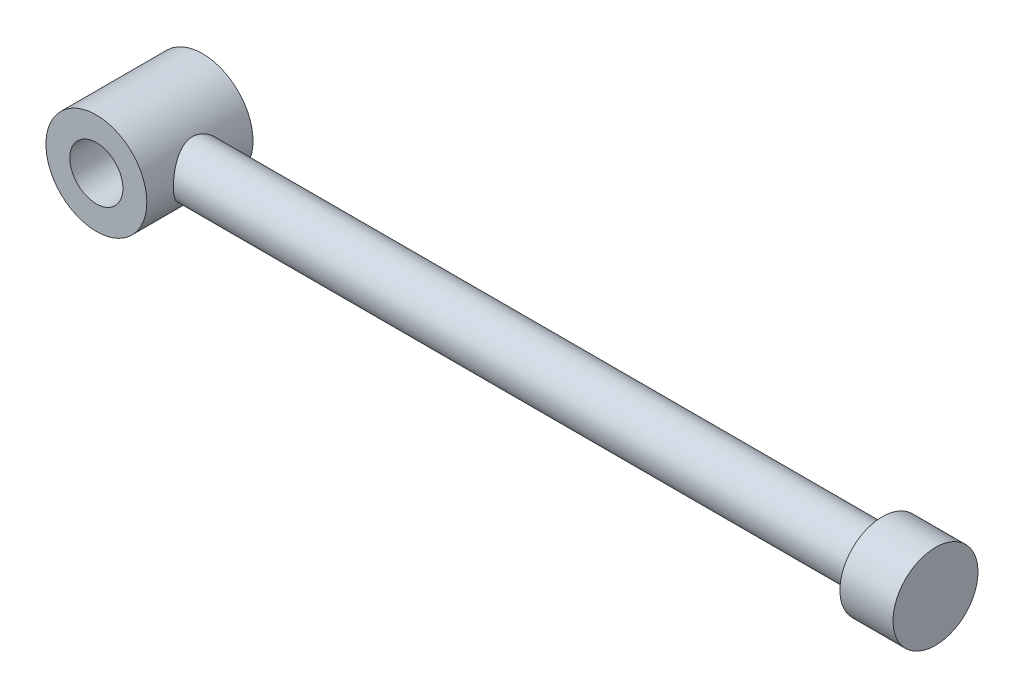
ISO-10303-21;
HEADER;
FILE_DESCRIPTION(('STEP AP214'),'2;1');
FILE_NAME('part.step','',(''),(''),'','','');
FILE_SCHEMA(('AUTOMOTIVE_DESIGN { 1 0 10303 214 1 1 1 1 }'));
ENDSEC;
DATA;
#1=APPLICATION_CONTEXT('core data for automotive mechanical design processes');
#2=APPLICATION_PROTOCOL_DEFINITION('international standard','automotive_design',2000,#1);
#3=PRODUCT_CONTEXT('',#1,'mechanical');
#4=PRODUCT('Part','Part','',(#3));
#5=PRODUCT_RELATED_PRODUCT_CATEGORY('part','',(#4));
#6=PRODUCT_DEFINITION_FORMATION('','',#4);
#7=PRODUCT_DEFINITION_CONTEXT('part definition',#1,'design');
#8=PRODUCT_DEFINITION('design','',#6,#7);
#9=PRODUCT_DEFINITION_SHAPE('','',#8);
#10=(LENGTH_UNIT() NAMED_UNIT(*) SI_UNIT(.MILLI.,.METRE.));
#11=(NAMED_UNIT(*) PLANE_ANGLE_UNIT() SI_UNIT($,.RADIAN.));
#12=(NAMED_UNIT(*) SI_UNIT($,.STERADIAN.) SOLID_ANGLE_UNIT());
#13=UNCERTAINTY_MEASURE_WITH_UNIT(LENGTH_MEASURE(1.E-05),#10,'distance_accuracy_value','');
#14=(GEOMETRIC_REPRESENTATION_CONTEXT(3) GLOBAL_UNCERTAINTY_ASSIGNED_CONTEXT((#13)) GLOBAL_UNIT_ASSIGNED_CONTEXT((#10,
#11,#12)) REPRESENTATION_CONTEXT('',''));
#15=CARTESIAN_POINT('',(0.,0.,0.));
#16=DIRECTION('',(0.,0.,1.));
#17=DIRECTION('',(1.,0.,0.));
#18=AXIS2_PLACEMENT_3D('',#15,#16,#17);
#19=CARTESIAN_POINT('',(-47.501,0.,50.));
#20=DIRECTION('',(1.,0.,0.));
#21=DIRECTION('',(0.,0.,-1.));
#22=AXIS2_PLACEMENT_3D('',#19,#20,#21);
#23=CYLINDRICAL_SURFACE('',#22,25.);
#24=CARTESIAN_POINT('',(47.5,0.,25.));
#25=CARTESIAN_POINT('',(47.5000012868615,0.653210005648805,24.9999984189527));
#26=CARTESIAN_POINT('',(47.4864969256654,1.3064017632076,25.0256276076706));
#27=CARTESIAN_POINT('',(47.4328271450133,2.60792040109773,25.1278270552912));
#28=CARTESIAN_POINT('',(47.3926520325506,3.25624542603795,25.204415834567));
#29=CARTESIAN_POINT('',(47.2865937217569,4.543781778911,25.4077356946252));
#30=CARTESIAN_POINT('',(47.2206738178416,5.18297873770769,25.5345383713909));
#31=CARTESIAN_POINT('',(47.0648009463964,6.4466923013975,25.8367586691402));
#32=CARTESIAN_POINT('',(46.9748499204126,7.07121008783191,26.0121723627373));
#33=CARTESIAN_POINT('',(46.77351252514,8.29903859802832,26.4088883693423));
#34=CARTESIAN_POINT('',(46.662214500575,8.90242500765568,26.6300018363401));
#35=CARTESIAN_POINT('',(46.4205251438248,10.0871400293849,27.1163883617665));
#36=CARTESIAN_POINT('',(46.290133493005,10.668468273176,27.3816621571534));
#37=CARTESIAN_POINT('',(46.0131633567224,11.8059925828862,27.9540499919354));
#38=CARTESIAN_POINT('',(45.8665869429102,12.362191852502,28.2611586776356));
#39=CARTESIAN_POINT('',(45.5603496507672,13.4470170679738,28.9149608944548));
#40=CARTESIAN_POINT('',(45.4006882652897,13.9756419438021,29.2616559600656));
#41=CARTESIAN_POINT('',(45.0608804824088,15.0365245154941,30.0161649406044));
#42=CARTESIAN_POINT('',(44.8800771090121,15.5667898220155,30.4264855788897));
#43=CARTESIAN_POINT('',(44.5115199918377,16.5912941968703,31.2869941791007));
#44=CARTESIAN_POINT('',(44.3237659993487,17.0855319741612,31.7371835684396));
#45=CARTESIAN_POINT('',(43.9454541186975,18.0363241815166,32.6755262803364));
#46=CARTESIAN_POINT('',(43.7548941430879,18.4928486935848,33.16370915817));
#47=CARTESIAN_POINT('',(43.4705035410843,19.1473751654127,33.9223876399194));
#48=CARTESIAN_POINT('',(43.3759440169057,19.3605161721058,34.1796933184854));
#49=CARTESIAN_POINT('',(43.1878464058039,19.7765530546089,34.7029511969597));
#50=CARTESIAN_POINT('',(43.0943086288976,19.9794458850909,34.9689059288576));
#51=CARTESIAN_POINT('',(42.7997824801065,20.6071398925124,35.8269162702008));
#52=CARTESIAN_POINT('',(42.6018128479872,21.0122636893607,36.4346039229729));
#53=CARTESIAN_POINT('',(42.2199051204113,21.7694632616239,37.6863729288068));
#54=CARTESIAN_POINT('',(42.0359660837698,22.1215425968568,38.3304518356564));
#55=CARTESIAN_POINT('',(41.7754597901157,22.6074041392903,39.3210233667337));
#56=CARTESIAN_POINT('',(41.6911958179642,22.7623073615842,39.6552694244928));
#57=CARTESIAN_POINT('',(41.5285941119277,23.0576289548345,40.3313991199896));
#58=CARTESIAN_POINT('',(41.4502548862744,23.1980509752141,40.6732808069124));
#59=CARTESIAN_POINT('',(41.2252906206975,23.5970096865404,41.7097132598094));
#60=CARTESIAN_POINT('',(41.0886727343803,23.8333241885109,42.4152246734291));
#61=CARTESIAN_POINT('',(40.8556757080805,24.2304247975414,43.8051473210687));
#62=CARTESIAN_POINT('',(40.7573273178392,24.3949844926856,44.4881558994101));
#63=CARTESIAN_POINT('',(40.5936090357843,24.6664581527837,45.869497624326));
#64=CARTESIAN_POINT('',(40.5282375826343,24.7733748469377,46.5678300437393));
#65=CARTESIAN_POINT('',(40.4335139823809,24.9276793009142,47.9727545054964));
#66=CARTESIAN_POINT('',(40.4041248948566,24.9751281131782,48.6793373239168));
#67=CARTESIAN_POINT('',(40.3826527550445,25.0098351950624,50.0945129659974));
#68=CARTESIAN_POINT('',(40.3905654051083,24.9971003986218,50.8031055487056));
#69=CARTESIAN_POINT('',(40.4396836607746,24.9175363361216,52.1189238521858));
#70=CARTESIAN_POINT('',(40.4762056391842,24.858314778447,52.7268049730818));
#71=CARTESIAN_POINT('',(40.5754581967302,24.6959765538041,53.9344419503098));
#72=CARTESIAN_POINT('',(40.6381859549812,24.5928646113338,54.5341986740095));
#73=CARTESIAN_POINT('',(40.7877744286167,24.3439617627407,55.7218738936112));
#74=CARTESIAN_POINT('',(40.8746426181526,24.1981576378827,56.3097886625516));
#75=CARTESIAN_POINT('',(41.0697824473386,23.865458546315,57.4702258259873));
#76=CARTESIAN_POINT('',(41.1780553297569,23.6785611936392,58.0427473245474));
#77=CARTESIAN_POINT('',(41.415509648249,23.2607938357275,59.1821512748899));
#78=CARTESIAN_POINT('',(41.5451054481903,23.0290318685274,59.7486194822438));
#79=CARTESIAN_POINT('',(41.8198850360253,22.5261913398115,60.8601562829761));
#80=CARTESIAN_POINT('',(41.9650753072168,22.2550964093174,61.405215846241));
#81=CARTESIAN_POINT('',(42.2673720302851,21.6754717146862,62.4716596679188));
#82=CARTESIAN_POINT('',(42.4244798284459,21.3669377188124,62.993041240839));
#83=CARTESIAN_POINT('',(42.7469928543765,20.7141772978487,64.0102874236911));
#84=CARTESIAN_POINT('',(42.9123988121994,20.3699477294912,64.5061497806989));
#85=CARTESIAN_POINT('',(43.2719213138128,19.5958648302528,65.5395022099402));
#86=CARTESIAN_POINT('',(43.4667684207784,19.1608014281108,66.0728447419581));
#87=CARTESIAN_POINT('',(43.8576200323991,18.2484378221221,67.1016758834893));
#88=CARTESIAN_POINT('',(44.0536246292987,17.7711342084233,67.5971614309606));
#89=CARTESIAN_POINT('',(44.4420207320027,16.7762354761974,68.5480906496818));
#90=CARTESIAN_POINT('',(44.6344101522551,16.2586179362902,69.0035117341117));
#91=CARTESIAN_POINT('',(45.0107695164139,15.18564644011,69.871393253905));
#92=CARTESIAN_POINT('',(45.19473935472,14.6302920107498,70.2838531505227));
#93=CARTESIAN_POINT('',(45.5598425591797,13.4518554744663,71.0851513110369));
#94=CARTESIAN_POINT('',(45.7402222097143,12.8267183241994,71.4713199238566));
#95=CARTESIAN_POINT('',(46.0815037451827,11.5406911125386,72.1890666678636));
#96=CARTESIAN_POINT('',(46.2424045530367,10.8797990770045,72.5206417806762));
#97=CARTESIAN_POINT('',(46.5399188360096,9.52707395321811,73.1253825092351));
#98=CARTESIAN_POINT('',(46.6765491964411,8.83526279856941,73.3985887601067));
#99=CARTESIAN_POINT('',(46.9214562264471,7.42552995353768,73.8834016709667));
#100=CARTESIAN_POINT('',(47.0297365558917,6.70761164712006,74.0950162825715));
#101=CARTESIAN_POINT('',(47.2063025356173,5.31624464248086,74.4377691399161));
#102=CARTESIAN_POINT('',(47.2772787942406,4.64447996173154,74.5743703861198));
#103=CARTESIAN_POINT('',(47.3908239853227,3.28964356491374,74.792113019902));
#104=CARTESIAN_POINT('',(47.4333945550407,2.60657250285341,74.8732576039218));
#105=CARTESIAN_POINT('',(47.4888942161964,1.23518421337437,74.9789329743327));
#106=CARTESIAN_POINT('',(47.5018371050761,0.546869577761149,75.0034901132096));
#107=CARTESIAN_POINT('',(47.4977429754556,-0.829331138014976,74.9957120351749));
#108=CARTESIAN_POINT('',(47.4807075815069,-1.51721723937977,74.963379901147));
#109=CARTESIAN_POINT('',(47.4199633468527,-2.82631266595643,74.847636739567));
#110=CARTESIAN_POINT('',(47.3787327970564,-3.44806419660546,74.7689693232958));
#111=CARTESIAN_POINT('',(47.2727513256109,-4.68191448626147,74.565637664317));
#112=CARTESIAN_POINT('',(47.2080021196142,-5.29401394597576,74.4409767767574));
#113=CARTESIAN_POINT('',(47.0564788293976,-6.50461442888487,74.1470090687094));
#114=CARTESIAN_POINT('',(46.9697036031434,-7.10311474521971,73.9776999332221));
#115=CARTESIAN_POINT('',(46.7760692238044,-8.2829203868051,73.5961366045217));
#116=CARTESIAN_POINT('',(46.6692092051901,-8.86422496977659,73.3838805605339));
#117=CARTESIAN_POINT('',(46.4347150835129,-10.0212061482669,72.9123476334389));
#118=CARTESIAN_POINT('',(46.3066165388274,-10.5963515340443,72.6519998429061));
#119=CARTESIAN_POINT('',(46.0344753537298,-11.7223121376793,72.0903430987564));
#120=CARTESIAN_POINT('',(45.8904326159748,-12.273127206966,71.789033895058));
#121=CARTESIAN_POINT('',(45.5893559244074,-13.3481196155596,71.147567173457));
#122=CARTESIAN_POINT('',(45.4323183484268,-13.8722894616322,70.8073988138707));
#123=CARTESIAN_POINT('',(45.1084463357129,-14.891749379032,70.0904014886548));
#124=CARTESIAN_POINT('',(44.9416110692081,-15.3870369972083,69.7135694161763));
#125=CARTESIAN_POINT('',(44.5834430543716,-16.3976696255483,68.8835384527642));
#126=CARTESIAN_POINT('',(44.391386042321,-16.9095920408677,68.4264780987071));
#127=CARTESIAN_POINT('',(44.0039822491004,-17.8935524239175,67.4725627711976));
#128=CARTESIAN_POINT('',(43.8086352568375,-18.3655878206209,66.9757052365235));
#129=CARTESIAN_POINT('',(43.4192990155421,-19.2680073125821,65.9440839102324));
#130=CARTESIAN_POINT('',(43.2253110444692,-19.6983560972869,65.4092886363342));
#131=CARTESIAN_POINT('',(42.9393320078645,-20.3104540101419,64.5809248709357));
#132=CARTESIAN_POINT('',(42.8448363451765,-20.5089219684943,64.3004317951026));
#133=CARTESIAN_POINT('',(42.6581146396775,-20.8945244204734,63.7308833208294));
#134=CARTESIAN_POINT('',(42.5658893550316,-21.0816551578508,63.44182513132));
#135=CARTESIAN_POINT('',(42.2821836621277,-21.648387979502,62.5253466521647));
#136=CARTESIAN_POINT('',(42.0958739406871,-22.0074505748293,61.8834255689584));
#137=CARTESIAN_POINT('',(41.7431236276811,-22.6694168934662,60.5660179268291));
#138=CARTESIAN_POINT('',(41.5766807501163,-22.9723270802346,59.8905352423994));
#139=CARTESIAN_POINT('',(41.346840774555,-23.3818986884155,58.8557553985277));
#140=CARTESIAN_POINT('',(41.2735522467588,-23.5109220486937,58.5073536644685));
#141=CARTESIAN_POINT('',(41.1343163849144,-23.7536861437125,57.8038943701701));
#142=CARTESIAN_POINT('',(41.0683671730645,-23.8674307891395,57.448838539705));
#143=CARTESIAN_POINT('',(40.9445349253845,-24.0792467759333,56.7327026485931));
#144=CARTESIAN_POINT('',(40.8866515829926,-24.1773187129978,56.3716228174865));
#145=CARTESIAN_POINT('',(40.7796224767826,-24.357407836073,55.644213350344));
#146=CARTESIAN_POINT('',(40.7304770415955,-24.4394244182567,55.2778835174161));
#147=CARTESIAN_POINT('',(40.6057967662459,-24.6463747628998,54.2444716794845));
#148=CARTESIAN_POINT('',(40.540792009732,-24.7528329908136,53.5722701238325));
#149=CARTESIAN_POINT('',(40.4440255103269,-24.9106277357834,52.2191604975385));
#150=CARTESIAN_POINT('',(40.412261394655,-24.9619681872586,51.5382530518523));
#151=CARTESIAN_POINT('',(40.3833585885334,-25.0087011248735,50.1741162716581));
#152=CARTESIAN_POINT('',(40.3862016617673,-25.0041230773561,49.490888349677));
#153=CARTESIAN_POINT('',(40.4263529278799,-24.9391549590638,48.1281498738633));
#154=CARTESIAN_POINT('',(40.4636590588784,-24.8787682272505,47.4486391000851));
#155=CARTESIAN_POINT('',(40.5648399015995,-24.7133939614667,46.1776946403491));
#156=CARTESIAN_POINT('',(40.6251335135233,-24.6143879473423,45.5851818903518));
#157=CARTESIAN_POINT('',(40.7693601975854,-24.3747577231145,44.4116382908909));
#158=CARTESIAN_POINT('',(40.8532909858077,-24.2341375338679,43.8306063379098));
#159=CARTESIAN_POINT('',(41.0422453523501,-23.9127328514679,42.6831461425766));
#160=CARTESIAN_POINT('',(41.1472745534444,-23.731937650217,42.1167218386985));
#161=CARTESIAN_POINT('',(41.3754389887695,-23.3318674406451,41.0013869645962));
#162=CARTESIAN_POINT('',(41.4985754980138,-23.112589722394,40.4524776309917));
#163=CARTESIAN_POINT('',(41.7682870353345,-22.6217509066285,39.3393169451693));
#164=CARTESIAN_POINT('',(41.9158673255616,-22.3477113926718,38.7764027662993));
#165=CARTESIAN_POINT('',(42.2240025992539,-21.7599102735164,37.6753974942969));
#166=CARTESIAN_POINT('',(42.3845588621876,-21.4461447494851,37.1373088572725));
#167=CARTESIAN_POINT('',(42.7147732764422,-20.7806674623987,36.0877713388811));
#168=CARTESIAN_POINT('',(42.8844349808573,-20.4289408313628,35.5763330126078));
#169=CARTESIAN_POINT('',(43.2289732699473,-19.6893956176216,34.5821006650165));
#170=CARTESIAN_POINT('',(43.4038501923953,-19.3015746937396,34.0993085050994));
#171=CARTESIAN_POINT('',(43.779666593767,-18.4348557884655,33.0987208403442));
#172=CARTESIAN_POINT('',(43.9808330381023,-17.9508038941647,32.5854622270724));
#173=CARTESIAN_POINT('',(44.3798425557348,-16.9403269072973,31.6010069304675));
#174=CARTESIAN_POINT('',(44.5776853211246,-16.4138979147737,31.1298141268786));
#175=CARTESIAN_POINT('',(44.965093290746,-15.3207960106173,30.2320026652285));
#176=CARTESIAN_POINT('',(45.1546529633333,-14.7540968494208,29.805413537525));
#177=CARTESIAN_POINT('',(45.5204713878906,-13.5835428528219,29.0001915026029));
#178=CARTESIAN_POINT('',(45.6967307275548,-12.9796896612664,28.6215564759614));
#179=CARTESIAN_POINT('',(46.0347216125046,-11.7253871022273,27.9082308560905));
#180=CARTESIAN_POINT('',(46.1960854534007,-11.0742405159844,27.5745887918062));
#181=CARTESIAN_POINT('',(46.4955689549722,-9.74059080737393,26.9639682375863));
#182=CARTESIAN_POINT('',(46.6336853985273,-9.05808336170359,26.686997589054));
#183=CARTESIAN_POINT('',(46.8822163721683,-7.6684261122792,26.1937506751666));
#184=CARTESIAN_POINT('',(46.9926962126177,-6.96133899059465,25.9773311700381));
#185=CARTESIAN_POINT('',(47.1828651283627,-5.52720161808715,25.6074196432007));
#186=CARTESIAN_POINT('',(47.2625716561756,-4.80016293377181,25.4538919505346));
#187=CARTESIAN_POINT('',(47.383203864536,-3.39625266550208,25.2224532923087));
#188=CARTESIAN_POINT('',(47.4268956788907,-2.72050573826541,25.1391345584971));
#189=CARTESIAN_POINT('',(47.485293344603,-1.3631659905592,25.0279082222891));
#190=CARTESIAN_POINT('',(47.4999986572617,-0.681573061681248,25.000001649698));
#191=CARTESIAN_POINT('',(47.5,0.,25.));
#192=B_SPLINE_CURVE_WITH_KNOTS('',3,(#24,#25,#26,#27,#28,#29,#30,#31,#32,#33,#34,#35,#36,#37,
#38,#39,#40,#41,#42,#43,#44,#45,#46,#47,#48,#49,#50,#51,#52,#53,#54,#55,#56,#57,#58,#59,#60,#61,
#62,#63,#64,#65,#66,#67,#68,#69,#70,#71,#72,#73,#74,#75,#76,#77,#78,#79,#80,#81,#82,#83,#84,#85,
#86,#87,#88,#89,#90,#91,#92,#93,#94,#95,#96,#97,#98,#99,#100,#101,#102,#103,#104,#105,#106,#107,
#108,#109,#110,#111,#112,#113,#114,#115,#116,#117,#118,#119,#120,#121,#122,#123,#124,#125,#126,
#127,#128,#129,#130,#131,#132,#133,#134,#135,#136,#137,#138,#139,#140,#141,#142,#143,#144,#145,
#146,#147,#148,#149,#150,#151,#152,#153,#154,#155,#156,#157,#158,#159,#160,#161,#162,#163,#164,
#165,#166,#167,#168,#169,#170,#171,#172,#173,#174,#175,#176,#177,#178,#179,#180,#181,#182,#183,
#184,#185,#186,#187,#188,#189,#190,#191),.UNSPECIFIED.,.T.,.F.,(4,2,2,2,2,2,2,2,2,2,2,2,2,2,2,2,
2,2,2,2,2,2,2,2,2,2,2,2,2,2,2,2,2,2,2,2,2,2,2,2,2,2,2,2,2,2,2,2,2,2,2,2,2,2,2,2,2,2,2,2,2,2,2,2,
2,2,2,2,2,2,2,2,2,2,2,2,2,2,2,2,2,2,2,4),(0.,1.95896117369795,3.91863468678357,5.88111246069397,
7.84343172808983,9.79779863013786,11.7521981503989,13.7063477967743,15.6605732178313,
17.7416755580336,19.8228524376791,21.9056647731855,22.9471645584139,23.9889720345601,
26.2561314882217,28.5231387248027,29.656511626403,30.7895982039054,33.055178114953,
35.1803302705381,37.305381798555,39.4282498597944,41.5508733448188,43.3842551855874,
45.2174397252984,47.0511924733008,48.8850517212751,50.7600281671573,52.6357871616,
54.5117583708719,56.3878949142266,58.5315762439003,60.6754307809375,62.8204862981945,
64.9655687118267,67.2324080174018,69.499372610319,71.7647538118776,74.0298424178697,
76.0945622442654,78.1591630531728,80.2228021934922,82.2863295066976,84.1683286254613,
86.050190482623,87.9321499329838,89.8141905026901,91.7447384632529,93.6752982109078,
95.6063979052907,97.5376613820294,99.6732661076762,101.809008384739,103.946544201833,
105.0153850116,106.084578034691,108.357699469492,110.630559092513,111.766245967225,
112.901641599328,114.036994066361,115.172389224756,117.220183967727,119.267832525217,
121.314402117583,123.360849274259,125.170073974151,126.979123919657,128.788656622159,
130.598316802713,132.526096660079,134.454066834599,136.382794883945,138.311648123278,
140.51005180811,142.708658043462,144.908710794385,147.108666275828,149.353296624119,
151.598237343461,153.83782164302,156.076133931278,158.12011724522,160.164138545148),.UNSPECIFIED.);
#193=CARTESIAN_POINT('',(47.5,0.,25.));
#194=VERTEX_POINT('',#193);
#195=EDGE_CURVE('E53',#194,#194,#192,.T.);
#196=ORIENTED_EDGE('',*,*,#195,.T.);
#197=EDGE_LOOP('',(#196));
#198=FACE_BOUND('',#197,.T.);
#199=CARTESIAN_POINT('',(690.,0.,50.));
#200=DIRECTION('',(1.,0.,0.));
#201=DIRECTION('',(0.,0.,-1.));
#202=AXIS2_PLACEMENT_3D('',#199,#200,#201);
#203=CIRCLE('',#202,25.);
#204=CARTESIAN_POINT('',(690.,0.,25.));
#205=VERTEX_POINT('',#204);
#206=EDGE_CURVE('E39',#205,#205,#203,.F.);
#207=ORIENTED_EDGE('',*,*,#206,.T.);
#208=EDGE_LOOP('',(#207));
#209=FACE_BOUND('',#208,.T.);
#210=ADVANCED_FACE('F35',(#198,#209),#23,.T.);
#211=CARTESIAN_POINT('',(0.,0.,100.));
#212=DIRECTION('',(0.,0.,1.));
#213=DIRECTION('',(1.,0.,0.));
#214=AXIS2_PLACEMENT_3D('',#211,#212,#213);
#215=PLANE('',#214);
#216=CARTESIAN_POINT('',(0.,0.,100.));
#217=DIRECTION('',(0.,0.,1.));
#218=DIRECTION('',(1.,0.,0.));
#219=AXIS2_PLACEMENT_3D('',#216,#217,#218);
#220=CIRCLE('',#219,47.5);
#221=CARTESIAN_POINT('',(47.5,0.,100.));
#222=VERTEX_POINT('',#221);
#223=EDGE_CURVE('E10',#222,#222,#220,.T.);
#224=ORIENTED_EDGE('',*,*,#223,.T.);
#225=EDGE_LOOP('',(#224));
#226=FACE_BOUND('',#225,.T.);
#227=CARTESIAN_POINT('',(0.,0.,100.));
#228=DIRECTION('',(0.,0.,1.));
#229=DIRECTION('',(1.,0.,0.));
#230=AXIS2_PLACEMENT_3D('',#227,#228,#229);
#231=CIRCLE('',#230,25.);
#232=CARTESIAN_POINT('',(25.,0.,100.));
#233=VERTEX_POINT('',#232);
#234=EDGE_CURVE('E48',#233,#233,#231,.T.);
#235=ORIENTED_EDGE('',*,*,#234,.F.);
#236=EDGE_LOOP('',(#235));
#237=FACE_BOUND('',#236,.T.);
#238=ADVANCED_FACE('F82',(#226,#237),#215,.T.);
#239=CARTESIAN_POINT('',(0.,0.,0.));
#240=DIRECTION('',(0.,0.,1.));
#241=DIRECTION('',(1.,0.,0.));
#242=AXIS2_PLACEMENT_3D('',#239,#240,#241);
#243=PLANE('',#242);
#244=CARTESIAN_POINT('',(0.,0.,0.));
#245=DIRECTION('',(0.,0.,1.));
#246=DIRECTION('',(1.,0.,0.));
#247=AXIS2_PLACEMENT_3D('',#244,#245,#246);
#248=CIRCLE('',#247,47.5);
#249=CARTESIAN_POINT('',(47.5,0.,0.));
#250=VERTEX_POINT('',#249);
#251=EDGE_CURVE('E43',#250,#250,#248,.T.);
#252=ORIENTED_EDGE('',*,*,#251,.F.);
#253=EDGE_LOOP('',(#252));
#254=FACE_BOUND('',#253,.T.);
#255=CARTESIAN_POINT('',(0.,0.,0.));
#256=DIRECTION('',(0.,0.,1.));
#257=DIRECTION('',(1.,0.,0.));
#258=AXIS2_PLACEMENT_3D('',#255,#256,#257);
#259=CIRCLE('',#258,25.);
#260=CARTESIAN_POINT('',(25.,0.,0.));
#261=VERTEX_POINT('',#260);
#262=EDGE_CURVE('E50',#261,#261,#259,.T.);
#263=ORIENTED_EDGE('',*,*,#262,.T.);
#264=EDGE_LOOP('',(#263));
#265=FACE_BOUND('',#264,.T.);
#266=ADVANCED_FACE('F87',(#254,#265),#243,.F.);
#267=CARTESIAN_POINT('',(0.,0.,100.));
#268=DIRECTION('',(0.,0.,-1.));
#269=DIRECTION('',(-1.,0.,0.));
#270=AXIS2_PLACEMENT_3D('',#267,#268,#269);
#271=CYLINDRICAL_SURFACE('',#270,47.5);
#272=ORIENTED_EDGE('',*,*,#195,.F.);
#273=EDGE_LOOP('',(#272));
#274=FACE_BOUND('',#273,.T.);
#275=ORIENTED_EDGE('',*,*,#223,.F.);
#276=EDGE_LOOP('',(#275));
#277=FACE_BOUND('',#276,.T.);
#278=ORIENTED_EDGE('',*,*,#251,.T.);
#279=EDGE_LOOP('',(#278));
#280=FACE_BOUND('',#279,.T.);
#281=ADVANCED_FACE('F37',(#274,#277,#280),#271,.T.);
#282=CARTESIAN_POINT('',(0.,0.,100.));
#283=DIRECTION('',(0.,0.,-1.));
#284=DIRECTION('',(-1.,0.,0.));
#285=AXIS2_PLACEMENT_3D('',#282,#283,#284);
#286=CYLINDRICAL_SURFACE('',#285,25.);
#287=ORIENTED_EDGE('',*,*,#234,.T.);
#288=EDGE_LOOP('',(#287));
#289=FACE_BOUND('',#288,.T.);
#290=ORIENTED_EDGE('',*,*,#262,.F.);
#291=EDGE_LOOP('',(#290));
#292=FACE_BOUND('',#291,.T.);
#293=ADVANCED_FACE('F100',(#289,#292),#286,.F.);
#294=CARTESIAN_POINT('',(690.,0.,50.));
#295=DIRECTION('',(1.,0.,0.));
#296=DIRECTION('',(0.,0.,-1.));
#297=AXIS2_PLACEMENT_3D('',#294,#295,#296);
#298=CYLINDRICAL_SURFACE('',#297,40.);
#299=CARTESIAN_POINT('',(690.,0.,50.));
#300=DIRECTION('',(1.,0.,0.));
#301=DIRECTION('',(0.,0.,-1.));
#302=AXIS2_PLACEMENT_3D('',#299,#300,#301);
#303=CIRCLE('',#302,40.);
#304=CARTESIAN_POINT('',(690.,0.,10.));
#305=VERTEX_POINT('',#304);
#306=EDGE_CURVE('E93',#305,#305,#303,.T.);
#307=ORIENTED_EDGE('',*,*,#306,.T.);
#308=EDGE_LOOP('',(#307));
#309=FACE_BOUND('',#308,.T.);
#310=CARTESIAN_POINT('',(740.,0.,50.));
#311=DIRECTION('',(1.,0.,0.));
#312=DIRECTION('',(0.,0.,-1.));
#313=AXIS2_PLACEMENT_3D('',#310,#311,#312);
#314=CIRCLE('',#313,40.);
#315=CARTESIAN_POINT('',(740.,0.,10.));
#316=VERTEX_POINT('',#315);
#317=EDGE_CURVE('E63',#316,#316,#314,.T.);
#318=ORIENTED_EDGE('',*,*,#317,.F.);
#319=EDGE_LOOP('',(#318));
#320=FACE_BOUND('',#319,.T.);
#321=ADVANCED_FACE('F70',(#309,#320),#298,.T.);
#322=CARTESIAN_POINT('',(690.,0.,50.));
#323=DIRECTION('',(1.,0.,0.));
#324=DIRECTION('',(0.,0.,-1.));
#325=AXIS2_PLACEMENT_3D('',#322,#323,#324);
#326=PLANE('',#325);
#327=ORIENTED_EDGE('',*,*,#206,.F.);
#328=EDGE_LOOP('',(#327));
#329=FACE_BOUND('',#328,.T.);
#330=ORIENTED_EDGE('',*,*,#306,.F.);
#331=EDGE_LOOP('',(#330));
#332=FACE_BOUND('',#331,.T.);
#333=ADVANCED_FACE('F74',(#329,#332),#326,.F.);
#334=CARTESIAN_POINT('',(740.,0.,50.));
#335=DIRECTION('',(1.,0.,0.));
#336=DIRECTION('',(0.,0.,-1.));
#337=AXIS2_PLACEMENT_3D('',#334,#335,#336);
#338=PLANE('',#337);
#339=ORIENTED_EDGE('',*,*,#317,.T.);
#340=EDGE_LOOP('',(#339));
#341=FACE_BOUND('',#340,.T.);
#342=ADVANCED_FACE('F72',(#341),#338,.T.);
#343=CLOSED_SHELL('',(#210,#238,#266,#281,#293,#321,#333,#342));
#344=MANIFOLD_SOLID_BREP('B2',#343);
#345=ADVANCED_BREP_SHAPE_REPRESENTATION('',(#18,#344),#14);
#346=SHAPE_DEFINITION_REPRESENTATION(#9,#345);
ENDSEC;
END-ISO-10303-21;
